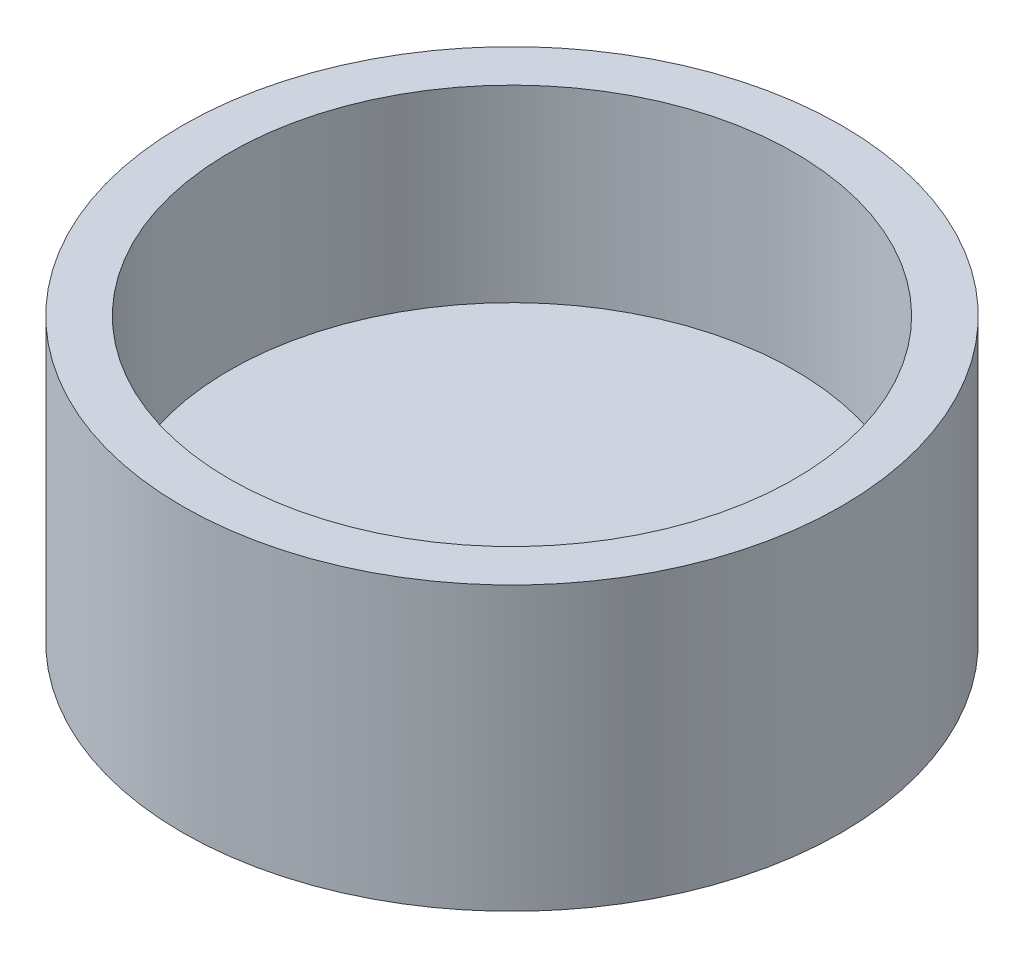
ISO-10303-21;
HEADER;
FILE_DESCRIPTION(('STEP AP214'),'2;1');
FILE_NAME('part.step','',(''),(''),'','','');
FILE_SCHEMA(('AUTOMOTIVE_DESIGN { 1 0 10303 214 1 1 1 1 }'));
ENDSEC;
DATA;
#1=APPLICATION_CONTEXT('core data for automotive mechanical design processes');
#2=APPLICATION_PROTOCOL_DEFINITION('international standard','automotive_design',2000,#1);
#3=PRODUCT_CONTEXT('',#1,'mechanical');
#4=PRODUCT('Part','Part','',(#3));
#5=PRODUCT_RELATED_PRODUCT_CATEGORY('part','',(#4));
#6=PRODUCT_DEFINITION_FORMATION('','',#4);
#7=PRODUCT_DEFINITION_CONTEXT('part definition',#1,'design');
#8=PRODUCT_DEFINITION('design','',#6,#7);
#9=PRODUCT_DEFINITION_SHAPE('','',#8);
#10=(LENGTH_UNIT() NAMED_UNIT(*) SI_UNIT(.MILLI.,.METRE.));
#11=(NAMED_UNIT(*) PLANE_ANGLE_UNIT() SI_UNIT($,.RADIAN.));
#12=(NAMED_UNIT(*) SI_UNIT($,.STERADIAN.) SOLID_ANGLE_UNIT());
#13=UNCERTAINTY_MEASURE_WITH_UNIT(LENGTH_MEASURE(1.E-05),#10,'distance_accuracy_value','');
#14=(GEOMETRIC_REPRESENTATION_CONTEXT(3) GLOBAL_UNCERTAINTY_ASSIGNED_CONTEXT((#13)) GLOBAL_UNIT_ASSIGNED_CONTEXT((#10,
#11,#12)) REPRESENTATION_CONTEXT('',''));
#15=CARTESIAN_POINT('',(0.,0.,0.));
#16=DIRECTION('',(0.,0.,1.));
#17=DIRECTION('',(1.,0.,0.));
#18=AXIS2_PLACEMENT_3D('',#15,#16,#17);
#19=CARTESIAN_POINT('',(0.,38.1,0.));
#20=DIRECTION('',(0.,-1.,0.));
#21=DIRECTION('',(0.,0.,-1.));
#22=AXIS2_PLACEMENT_3D('',#19,#20,#21);
#23=CYLINDRICAL_SURFACE('',#22,44.45);
#24=CARTESIAN_POINT('',(0.,38.1,0.));
#25=DIRECTION('',(0.,1.,0.));
#26=DIRECTION('',(0.,0.,1.));
#27=AXIS2_PLACEMENT_3D('',#24,#25,#26);
#28=CIRCLE('',#27,44.45);
#29=CARTESIAN_POINT('',(0.,38.1,-44.45));
#30=VERTEX_POINT('',#29);
#31=EDGE_CURVE('E10',#30,#30,#28,.T.);
#32=CARTESIAN_POINT('',(0.,0.,0.));
#33=DIRECTION('',(0.,1.,0.));
#34=DIRECTION('',(0.,0.,1.));
#35=AXIS2_PLACEMENT_3D('',#32,#33,#34);
#36=CIRCLE('',#35,44.45);
#37=CARTESIAN_POINT('',(0.,0.,-44.45));
#38=VERTEX_POINT('',#37);
#39=EDGE_CURVE('E44',#38,#38,#36,.T.);
#40=CARTESIAN_POINT('',(0.,38.1,-44.45));
#41=CARTESIAN_POINT('',(0.,37.703125,-44.45));
#42=CARTESIAN_POINT('',(0.,37.30625,-44.45));
#43=CARTESIAN_POINT('',(0.,36.5125,-44.45));
#44=CARTESIAN_POINT('',(0.,36.115625,-44.45));
#45=CARTESIAN_POINT('',(0.,35.321875,-44.45));
#46=CARTESIAN_POINT('',(0.,34.925,-44.45));
#47=CARTESIAN_POINT('',(0.,34.13125,-44.45));
#48=CARTESIAN_POINT('',(0.,33.734375,-44.45));
#49=CARTESIAN_POINT('',(0.,32.940625,-44.45));
#50=CARTESIAN_POINT('',(0.,32.54375,-44.45));
#51=CARTESIAN_POINT('',(0.,31.75,-44.45));
#52=CARTESIAN_POINT('',(0.,31.353125,-44.45));
#53=CARTESIAN_POINT('',(0.,30.559375,-44.45));
#54=CARTESIAN_POINT('',(0.,30.1625,-44.45));
#55=CARTESIAN_POINT('',(0.,29.36875,-44.45));
#56=CARTESIAN_POINT('',(0.,28.971875,-44.45));
#57=CARTESIAN_POINT('',(0.,28.178125,-44.45));
#58=CARTESIAN_POINT('',(0.,27.78125,-44.45));
#59=CARTESIAN_POINT('',(0.,26.9875,-44.45));
#60=CARTESIAN_POINT('',(0.,26.590625,-44.45));
#61=CARTESIAN_POINT('',(0.,25.796875,-44.45));
#62=CARTESIAN_POINT('',(0.,25.4,-44.45));
#63=CARTESIAN_POINT('',(0.,24.60625,-44.45));
#64=CARTESIAN_POINT('',(0.,24.209375,-44.45));
#65=CARTESIAN_POINT('',(0.,23.415625,-44.45));
#66=CARTESIAN_POINT('',(0.,23.01875,-44.45));
#67=CARTESIAN_POINT('',(0.,22.225,-44.45));
#68=CARTESIAN_POINT('',(0.,21.828125,-44.45));
#69=CARTESIAN_POINT('',(0.,21.034375,-44.45));
#70=CARTESIAN_POINT('',(0.,20.6375,-44.45));
#71=CARTESIAN_POINT('',(0.,19.84375,-44.45));
#72=CARTESIAN_POINT('',(0.,19.446875,-44.45));
#73=CARTESIAN_POINT('',(0.,18.653125,-44.45));
#74=CARTESIAN_POINT('',(0.,18.25625,-44.45));
#75=CARTESIAN_POINT('',(0.,17.4625,-44.45));
#76=CARTESIAN_POINT('',(0.,17.065625,-44.45));
#77=CARTESIAN_POINT('',(0.,16.271875,-44.45));
#78=CARTESIAN_POINT('',(0.,15.875,-44.45));
#79=CARTESIAN_POINT('',(0.,15.08125,-44.45));
#80=CARTESIAN_POINT('',(0.,14.684375,-44.45));
#81=CARTESIAN_POINT('',(0.,13.890625,-44.45));
#82=CARTESIAN_POINT('',(0.,13.49375,-44.45));
#83=CARTESIAN_POINT('',(0.,12.7,-44.45));
#84=CARTESIAN_POINT('',(0.,12.303125,-44.45));
#85=CARTESIAN_POINT('',(0.,11.509375,-44.45));
#86=CARTESIAN_POINT('',(0.,11.1125,-44.45));
#87=CARTESIAN_POINT('',(0.,10.31875,-44.45));
#88=CARTESIAN_POINT('',(0.,9.921875,-44.45));
#89=CARTESIAN_POINT('',(0.,9.128125,-44.45));
#90=CARTESIAN_POINT('',(0.,8.73125,-44.45));
#91=CARTESIAN_POINT('',(0.,7.9375,-44.45));
#92=CARTESIAN_POINT('',(0.,7.540625,-44.45));
#93=CARTESIAN_POINT('',(0.,6.746875,-44.45));
#94=CARTESIAN_POINT('',(0.,6.35,-44.45));
#95=CARTESIAN_POINT('',(0.,5.55625,-44.45));
#96=CARTESIAN_POINT('',(0.,5.159375,-44.45));
#97=CARTESIAN_POINT('',(0.,4.365625,-44.45));
#98=CARTESIAN_POINT('',(0.,3.96875,-44.45));
#99=CARTESIAN_POINT('',(0.,3.175,-44.45));
#100=CARTESIAN_POINT('',(0.,2.778125,-44.45));
#101=CARTESIAN_POINT('',(0.,1.984375,-44.45));
#102=CARTESIAN_POINT('',(0.,1.5875,-44.45));
#103=CARTESIAN_POINT('',(0.,0.79375,-44.45));
#104=CARTESIAN_POINT('',(0.,0.396875,-44.45));
#105=CARTESIAN_POINT('',(0.,0.,-44.45));
#106=B_SPLINE_CURVE_WITH_KNOTS('',3,(#40,#41,#42,#43,#44,#45,#46,#47,#48,#49,#50,#51,#52,#53,
#54,#55,#56,#57,#58,#59,#60,#61,#62,#63,#64,#65,#66,#67,#68,#69,#70,#71,#72,#73,#74,#75,#76,#77,
#78,#79,#80,#81,#82,#83,#84,#85,#86,#87,#88,#89,#90,#91,#92,#93,#94,#95,#96,#97,#98,#99,#100,
#101,#102,#103,#104,#105),.UNSPECIFIED.,.F.,.F.,(4,2,2,2,2,2,2,2,2,2,2,2,2,2,2,2,2,2,2,2,2,2,2,
2,2,2,2,2,2,2,2,2,4),(0.,1.19062499999999,2.38124999999999,3.571875,4.7625,5.953125,7.14375,
8.33437499999999,9.525,10.715625,11.90625,13.096875,14.2875,15.478125,16.66875,17.859375,19.05,
20.240625,21.43125,22.621875,23.8125,25.003125,26.19375,27.384375,28.575,29.765625,30.95625,
32.146875,33.3375,34.528125,35.71875,36.909375,38.1),.UNSPECIFIED.);
#107=EDGE_CURVE('BSEAM41',#30,#38,#106,.T.);
#108=ORIENTED_EDGE('',*,*,#31,.F.);
#109=ORIENTED_EDGE('',*,*,#39,.T.);
#110=ORIENTED_EDGE('',*,*,#107,.T.);
#111=ORIENTED_EDGE('',*,*,#107,.F.);
#112=EDGE_LOOP('',(#108,#110,#109,#111));
#113=FACE_BOUND('',#112,.T.);
#114=ADVANCED_FACE('F41',(#113),#23,.T.);
#115=CARTESIAN_POINT('',(0.,38.1,0.));
#116=DIRECTION('',(0.,1.,0.));
#117=DIRECTION('',(0.,0.,1.));
#118=AXIS2_PLACEMENT_3D('',#115,#116,#117);
#119=PLANE('',#118);
#120=CARTESIAN_POINT('',(0.,38.1,0.));
#121=DIRECTION('',(0.,1.,0.));
#122=DIRECTION('',(0.,0.,1.));
#123=AXIS2_PLACEMENT_3D('',#120,#121,#122);
#124=CIRCLE('',#123,38.1);
#125=CARTESIAN_POINT('',(0.,38.1,38.1));
#126=VERTEX_POINT('',#125);
#127=EDGE_CURVE('E53',#126,#126,#124,.T.);
#128=ORIENTED_EDGE('',*,*,#127,.F.);
#129=EDGE_LOOP('',(#128));
#130=FACE_BOUND('',#129,.T.);
#131=ORIENTED_EDGE('',*,*,#31,.T.);
#132=EDGE_LOOP('',(#131));
#133=FACE_BOUND('',#132,.T.);
#134=ADVANCED_FACE('F68',(#130,#133),#119,.T.);
#135=CARTESIAN_POINT('',(0.,0.,0.));
#136=DIRECTION('',(0.,1.,0.));
#137=DIRECTION('',(0.,0.,1.));
#138=AXIS2_PLACEMENT_3D('',#135,#136,#137);
#139=PLANE('',#138);
#140=ORIENTED_EDGE('',*,*,#39,.F.);
#141=EDGE_LOOP('',(#140));
#142=FACE_BOUND('',#141,.T.);
#143=ADVANCED_FACE('F64',(#142),#139,.F.);
#144=CARTESIAN_POINT('',(0.,12.7,0.));
#145=DIRECTION('',(0.,1.,0.));
#146=DIRECTION('',(0.,0.,1.));
#147=AXIS2_PLACEMENT_3D('',#144,#145,#146);
#148=CYLINDRICAL_SURFACE('',#147,38.1);
#149=CARTESIAN_POINT('',(0.,12.7,0.));
#150=DIRECTION('',(0.,1.,0.));
#151=DIRECTION('',(0.,0.,1.));
#152=AXIS2_PLACEMENT_3D('',#149,#150,#151);
#153=CIRCLE('',#152,38.1);
#154=CARTESIAN_POINT('',(0.,12.7,38.1));
#155=VERTEX_POINT('',#154);
#156=EDGE_CURVE('E51',#155,#155,#153,.T.);
#157=ORIENTED_EDGE('',*,*,#156,.F.);
#158=EDGE_LOOP('',(#157));
#159=FACE_BOUND('',#158,.T.);
#160=ORIENTED_EDGE('',*,*,#127,.T.);
#161=EDGE_LOOP('',(#160));
#162=FACE_BOUND('',#161,.T.);
#163=ADVANCED_FACE('F61',(#159,#162),#148,.F.);
#164=CARTESIAN_POINT('',(0.,12.7,0.));
#165=DIRECTION('',(0.,1.,0.));
#166=DIRECTION('',(0.,0.,1.));
#167=AXIS2_PLACEMENT_3D('',#164,#165,#166);
#168=PLANE('',#167);
#169=ORIENTED_EDGE('',*,*,#156,.T.);
#170=EDGE_LOOP('',(#169));
#171=FACE_BOUND('',#170,.T.);
#172=ADVANCED_FACE('F59',(#171),#168,.T.);
#173=CLOSED_SHELL('',(#114,#134,#143,#163,#172));
#174=MANIFOLD_SOLID_BREP('B2',#173);
#175=ADVANCED_BREP_SHAPE_REPRESENTATION('',(#18,#174),#14);
#176=SHAPE_DEFINITION_REPRESENTATION(#9,#175);
ENDSEC;
END-ISO-10303-21;
